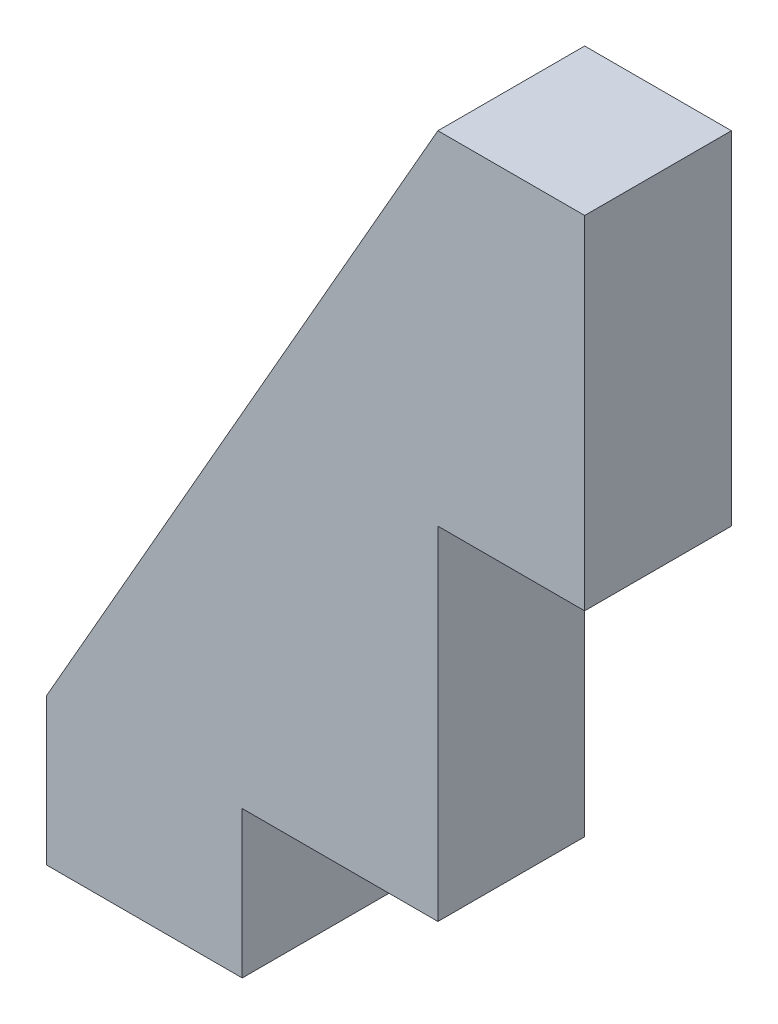
ISO-10303-21;
HEADER;
FILE_DESCRIPTION(('STEP AP214'),'2;1');
FILE_NAME('part.step','',(''),(''),'','','');
FILE_SCHEMA(('AUTOMOTIVE_DESIGN { 1 0 10303 214 1 1 1 1 }'));
ENDSEC;
DATA;
#1=APPLICATION_CONTEXT('core data for automotive mechanical design processes');
#2=APPLICATION_PROTOCOL_DEFINITION('international standard','automotive_design',2000,#1);
#3=PRODUCT_CONTEXT('',#1,'mechanical');
#4=PRODUCT('Part','Part','',(#3));
#5=PRODUCT_RELATED_PRODUCT_CATEGORY('part','',(#4));
#6=PRODUCT_DEFINITION_FORMATION('','',#4);
#7=PRODUCT_DEFINITION_CONTEXT('part definition',#1,'design');
#8=PRODUCT_DEFINITION('design','',#6,#7);
#9=PRODUCT_DEFINITION_SHAPE('','',#8);
#10=(LENGTH_UNIT() NAMED_UNIT(*) SI_UNIT(.MILLI.,.METRE.));
#11=(NAMED_UNIT(*) PLANE_ANGLE_UNIT() SI_UNIT($,.RADIAN.));
#12=(NAMED_UNIT(*) SI_UNIT($,.STERADIAN.) SOLID_ANGLE_UNIT());
#13=UNCERTAINTY_MEASURE_WITH_UNIT(LENGTH_MEASURE(1.E-05),#10,'distance_accuracy_value','');
#14=(GEOMETRIC_REPRESENTATION_CONTEXT(3) GLOBAL_UNCERTAINTY_ASSIGNED_CONTEXT((#13)) GLOBAL_UNIT_ASSIGNED_CONTEXT((#10,
#11,#12)) REPRESENTATION_CONTEXT('',''));
#15=CARTESIAN_POINT('',(0.,0.,0.));
#16=DIRECTION('',(0.,0.,1.));
#17=DIRECTION('',(1.,0.,0.));
#18=AXIS2_PLACEMENT_3D('',#15,#16,#17);
#19=CARTESIAN_POINT('',(8.,0.,3.));
#20=DIRECTION('',(-1.,0.,0.));
#21=DIRECTION('',(0.,0.,1.));
#22=AXIS2_PLACEMENT_3D('',#19,#20,#21);
#23=PLANE('',#22);
#24=DIRECTION('',(0.,0.,-1.));
#25=VECTOR('',#24,1.);
#26=CARTESIAN_POINT('',(8.,7.,3.));
#27=LINE('',#26,#25);
#28=CARTESIAN_POINT('',(8.,7.,3.));
#29=VERTEX_POINT('',#28);
#30=CARTESIAN_POINT('',(8.,7.,0.));
#31=VERTEX_POINT('',#30);
#32=EDGE_CURVE('E54',#29,#31,#27,.T.);
#33=ORIENTED_EDGE('',*,*,#32,.F.);
#34=DIRECTION('',(0.,1.,0.));
#35=VECTOR('',#34,1.);
#36=CARTESIAN_POINT('',(8.,0.,3.));
#37=LINE('',#36,#35);
#38=CARTESIAN_POINT('',(8.,0.,3.));
#39=VERTEX_POINT('',#38);
#40=EDGE_CURVE('E167',#39,#29,#37,.T.);
#41=ORIENTED_EDGE('',*,*,#40,.F.);
#42=DIRECTION('',(0.,0.,-1.));
#43=VECTOR('',#42,1.);
#44=CARTESIAN_POINT('',(8.,0.,3.));
#45=LINE('',#44,#43);
#46=CARTESIAN_POINT('',(8.,0.,0.));
#47=VERTEX_POINT('',#46);
#48=EDGE_CURVE('E47',#39,#47,#45,.T.);
#49=ORIENTED_EDGE('',*,*,#48,.T.);
#50=DIRECTION('',(0.,1.,0.));
#51=VECTOR('',#50,1.);
#52=CARTESIAN_POINT('',(8.,0.,0.));
#53=LINE('',#52,#51);
#54=EDGE_CURVE('E165',#47,#31,#53,.T.);
#55=ORIENTED_EDGE('',*,*,#54,.T.);
#56=EDGE_LOOP('',(#33,#41,#49,#55));
#57=FACE_BOUND('',#56,.T.);
#58=ADVANCED_FACE('F39',(#57),#23,.F.);
#59=CARTESIAN_POINT('',(0.,0.,3.));
#60=DIRECTION('',(0.,1.,0.));
#61=DIRECTION('',(0.,0.,1.));
#62=AXIS2_PLACEMENT_3D('',#59,#60,#61);
#63=PLANE('',#62);
#64=DIRECTION('',(0.,0.,1.));
#65=VECTOR('',#64,1.);
#66=CARTESIAN_POINT('',(4.,0.,0.));
#67=LINE('',#66,#65);
#68=CARTESIAN_POINT('',(4.,0.,0.));
#69=VERTEX_POINT('',#68);
#70=CARTESIAN_POINT('',(4.,0.,3.));
#71=VERTEX_POINT('',#70);
#72=EDGE_CURVE('E62',#69,#71,#67,.T.);
#73=ORIENTED_EDGE('',*,*,#72,.F.);
#74=DIRECTION('',(1.,0.,0.));
#75=VECTOR('',#74,1.);
#76=CARTESIAN_POINT('',(0.,0.,0.));
#77=LINE('',#76,#75);
#78=EDGE_CURVE('E170',#69,#47,#77,.T.);
#79=ORIENTED_EDGE('',*,*,#78,.T.);
#80=ORIENTED_EDGE('',*,*,#48,.F.);
#81=DIRECTION('',(1.,0.,0.));
#82=VECTOR('',#81,1.);
#83=CARTESIAN_POINT('',(0.,0.,3.));
#84=LINE('',#83,#82);
#85=EDGE_CURVE('E164',#71,#39,#84,.T.);
#86=ORIENTED_EDGE('',*,*,#85,.F.);
#87=EDGE_LOOP('',(#73,#79,#80,#86));
#88=FACE_BOUND('',#87,.T.);
#89=ADVANCED_FACE('F199',(#88),#63,.F.);
#90=CARTESIAN_POINT('',(8.,14.,3.));
#91=DIRECTION('',(0.868243142124459,-0.496138938356834,0.));
#92=DIRECTION('',(0.496138938356834,0.868243142124459,0.));
#93=AXIS2_PLACEMENT_3D('',#90,#91,#92);
#94=PLANE('',#93);
#95=DIRECTION('',(-0.496138938356834,-0.868243142124459,0.));
#96=VECTOR('',#95,1.);
#97=CARTESIAN_POINT('',(8.,14.,0.));
#98=LINE('',#97,#96);
#99=CARTESIAN_POINT('',(8.,14.,0.));
#100=VERTEX_POINT('',#99);
#101=CARTESIAN_POINT('',(0.,0.,0.));
#102=VERTEX_POINT('',#101);
#103=EDGE_CURVE('E161',#100,#102,#98,.T.);
#104=ORIENTED_EDGE('',*,*,#103,.T.);
#105=DIRECTION('',(0.,0.,-1.));
#106=VECTOR('',#105,1.);
#107=CARTESIAN_POINT('',(0.,0.,3.));
#108=LINE('',#107,#106);
#109=CARTESIAN_POINT('',(0.,0.,3.));
#110=VERTEX_POINT('',#109);
#111=EDGE_CURVE('E11',#110,#102,#108,.T.);
#112=ORIENTED_EDGE('',*,*,#111,.F.);
#113=DIRECTION('',(-0.496138938356834,-0.868243142124459,0.));
#114=VECTOR('',#113,1.);
#115=CARTESIAN_POINT('',(8.,14.,3.));
#116=LINE('',#115,#114);
#117=CARTESIAN_POINT('',(8.,14.,3.));
#118=VERTEX_POINT('',#117);
#119=EDGE_CURVE('E162',#118,#110,#116,.T.);
#120=ORIENTED_EDGE('',*,*,#119,.F.);
#121=DIRECTION('',(0.,0.,-1.));
#122=VECTOR('',#121,1.);
#123=CARTESIAN_POINT('',(8.,14.,3.));
#124=LINE('',#123,#122);
#125=EDGE_CURVE('E133',#118,#100,#124,.T.);
#126=ORIENTED_EDGE('',*,*,#125,.T.);
#127=EDGE_LOOP('',(#104,#112,#120,#126));
#128=FACE_BOUND('',#127,.T.);
#129=ADVANCED_FACE('F41',(#128),#94,.F.);
#130=CARTESIAN_POINT('',(0.,0.,3.));
#131=DIRECTION('',(0.,0.,1.));
#132=DIRECTION('',(1.,0.,0.));
#133=AXIS2_PLACEMENT_3D('',#130,#131,#132);
#134=PLANE('',#133);
#135=ORIENTED_EDGE('',*,*,#119,.T.);
#136=DIRECTION('',(0.,1.,0.));
#137=VECTOR('',#136,1.);
#138=CARTESIAN_POINT('',(0.,-3.,3.));
#139=LINE('',#138,#137);
#140=CARTESIAN_POINT('',(0.,-3.,3.));
#141=VERTEX_POINT('',#140);
#142=EDGE_CURVE('E148',#141,#110,#139,.T.);
#143=ORIENTED_EDGE('',*,*,#142,.F.);
#144=DIRECTION('',(-1.,0.,0.));
#145=VECTOR('',#144,1.);
#146=CARTESIAN_POINT('',(4.,-3.,3.));
#147=LINE('',#146,#145);
#148=CARTESIAN_POINT('',(4.,-3.,3.));
#149=VERTEX_POINT('',#148);
#150=EDGE_CURVE('E147',#149,#141,#147,.T.);
#151=ORIENTED_EDGE('',*,*,#150,.F.);
#152=DIRECTION('',(0.,1.,0.));
#153=VECTOR('',#152,1.);
#154=CARTESIAN_POINT('',(4.,-3.,3.));
#155=LINE('',#154,#153);
#156=EDGE_CURVE('E152',#149,#71,#155,.T.);
#157=ORIENTED_EDGE('',*,*,#156,.T.);
#158=ORIENTED_EDGE('',*,*,#85,.T.);
#159=ORIENTED_EDGE('',*,*,#40,.T.);
#160=DIRECTION('',(-1.,0.,0.));
#161=VECTOR('',#160,1.);
#162=CARTESIAN_POINT('',(11.,7.,3.));
#163=LINE('',#162,#161);
#164=CARTESIAN_POINT('',(11.,7.,3.));
#165=VERTEX_POINT('',#164);
#166=EDGE_CURVE('E118',#165,#29,#163,.T.);
#167=ORIENTED_EDGE('',*,*,#166,.F.);
#168=DIRECTION('',(0.,-1.,0.));
#169=VECTOR('',#168,1.);
#170=CARTESIAN_POINT('',(11.,14.,3.));
#171=LINE('',#170,#169);
#172=CARTESIAN_POINT('',(11.,14.,3.));
#173=VERTEX_POINT('',#172);
#174=EDGE_CURVE('E111',#173,#165,#171,.T.);
#175=ORIENTED_EDGE('',*,*,#174,.F.);
#176=DIRECTION('',(-1.,0.,0.));
#177=VECTOR('',#176,1.);
#178=CARTESIAN_POINT('',(11.,14.,3.));
#179=LINE('',#178,#177);
#180=EDGE_CURVE('E115',#173,#118,#179,.T.);
#181=ORIENTED_EDGE('',*,*,#180,.T.);
#182=EDGE_LOOP('',(#135,#143,#151,#157,#158,#159,#167,#175,#181));
#183=FACE_BOUND('',#182,.T.);
#184=ADVANCED_FACE('F113',(#183),#134,.T.);
#185=CARTESIAN_POINT('',(0.,0.,0.));
#186=DIRECTION('',(0.,0.,1.));
#187=DIRECTION('',(1.,0.,0.));
#188=AXIS2_PLACEMENT_3D('',#185,#186,#187);
#189=PLANE('',#188);
#190=ORIENTED_EDGE('',*,*,#103,.F.);
#191=DIRECTION('',(-1.,0.,0.));
#192=VECTOR('',#191,1.);
#193=CARTESIAN_POINT('',(11.,14.,0.));
#194=LINE('',#193,#192);
#195=CARTESIAN_POINT('',(11.,14.,0.));
#196=VERTEX_POINT('',#195);
#197=EDGE_CURVE('E183',#196,#100,#194,.T.);
#198=ORIENTED_EDGE('',*,*,#197,.F.);
#199=DIRECTION('',(0.,1.,0.));
#200=VECTOR('',#199,1.);
#201=CARTESIAN_POINT('',(11.,7.,0.));
#202=LINE('',#201,#200);
#203=CARTESIAN_POINT('',(11.,7.,0.));
#204=VERTEX_POINT('',#203);
#205=EDGE_CURVE('E127',#204,#196,#202,.T.);
#206=ORIENTED_EDGE('',*,*,#205,.F.);
#207=DIRECTION('',(-1.,0.,0.));
#208=VECTOR('',#207,1.);
#209=CARTESIAN_POINT('',(11.,7.,0.));
#210=LINE('',#209,#208);
#211=EDGE_CURVE('E137',#204,#31,#210,.T.);
#212=ORIENTED_EDGE('',*,*,#211,.T.);
#213=ORIENTED_EDGE('',*,*,#54,.F.);
#214=ORIENTED_EDGE('',*,*,#78,.F.);
#215=DIRECTION('',(0.,1.,0.));
#216=VECTOR('',#215,1.);
#217=CARTESIAN_POINT('',(4.,-3.,0.));
#218=LINE('',#217,#216);
#219=CARTESIAN_POINT('',(4.,-3.,0.));
#220=VERTEX_POINT('',#219);
#221=EDGE_CURVE('E155',#220,#69,#218,.T.);
#222=ORIENTED_EDGE('',*,*,#221,.F.);
#223=DIRECTION('',(1.,0.,0.));
#224=VECTOR('',#223,1.);
#225=CARTESIAN_POINT('',(0.,-3.,0.));
#226=LINE('',#225,#224);
#227=CARTESIAN_POINT('',(0.,-3.,0.));
#228=VERTEX_POINT('',#227);
#229=EDGE_CURVE('E143',#228,#220,#226,.T.);
#230=ORIENTED_EDGE('',*,*,#229,.F.);
#231=DIRECTION('',(0.,1.,0.));
#232=VECTOR('',#231,1.);
#233=CARTESIAN_POINT('',(0.,-3.,0.));
#234=LINE('',#233,#232);
#235=EDGE_CURVE('E158',#228,#102,#234,.T.);
#236=ORIENTED_EDGE('',*,*,#235,.T.);
#237=EDGE_LOOP('',(#190,#198,#206,#212,#213,#214,#222,#230,#236));
#238=FACE_BOUND('',#237,.T.);
#239=ADVANCED_FACE('F179',(#238),#189,.F.);
#240=CARTESIAN_POINT('',(0.,-3.,3.));
#241=DIRECTION('',(1.,0.,0.));
#242=DIRECTION('',(0.,0.,-1.));
#243=AXIS2_PLACEMENT_3D('',#240,#241,#242);
#244=PLANE('',#243);
#245=ORIENTED_EDGE('',*,*,#111,.T.);
#246=ORIENTED_EDGE('',*,*,#235,.F.);
#247=DIRECTION('',(0.,0.,-1.));
#248=VECTOR('',#247,1.);
#249=CARTESIAN_POINT('',(0.,-3.,3.));
#250=LINE('',#249,#248);
#251=EDGE_CURVE('E135',#141,#228,#250,.T.);
#252=ORIENTED_EDGE('',*,*,#251,.F.);
#253=ORIENTED_EDGE('',*,*,#142,.T.);
#254=EDGE_LOOP('',(#245,#246,#252,#253));
#255=FACE_BOUND('',#254,.T.);
#256=ADVANCED_FACE('F207',(#255),#244,.F.);
#257=CARTESIAN_POINT('',(4.,-3.,0.));
#258=DIRECTION('',(-1.,0.,0.));
#259=DIRECTION('',(0.,0.,1.));
#260=AXIS2_PLACEMENT_3D('',#257,#258,#259);
#261=PLANE('',#260);
#262=ORIENTED_EDGE('',*,*,#72,.T.);
#263=ORIENTED_EDGE('',*,*,#156,.F.);
#264=DIRECTION('',(0.,0.,1.));
#265=VECTOR('',#264,1.);
#266=CARTESIAN_POINT('',(4.,-3.,0.));
#267=LINE('',#266,#265);
#268=EDGE_CURVE('E145',#220,#149,#267,.T.);
#269=ORIENTED_EDGE('',*,*,#268,.F.);
#270=ORIENTED_EDGE('',*,*,#221,.T.);
#271=EDGE_LOOP('',(#262,#263,#269,#270));
#272=FACE_BOUND('',#271,.T.);
#273=ADVANCED_FACE('F212',(#272),#261,.F.);
#274=CARTESIAN_POINT('',(0.,-3.,0.));
#275=DIRECTION('',(0.,-1.,0.));
#276=DIRECTION('',(0.,0.,-1.));
#277=AXIS2_PLACEMENT_3D('',#274,#275,#276);
#278=PLANE('',#277);
#279=ORIENTED_EDGE('',*,*,#251,.T.);
#280=ORIENTED_EDGE('',*,*,#229,.T.);
#281=ORIENTED_EDGE('',*,*,#268,.T.);
#282=ORIENTED_EDGE('',*,*,#150,.T.);
#283=EDGE_LOOP('',(#279,#280,#281,#282));
#284=FACE_BOUND('',#283,.T.);
#285=ADVANCED_FACE('F196',(#284),#278,.T.);
#286=CARTESIAN_POINT('',(11.,14.,0.));
#287=DIRECTION('',(0.,-1.,0.));
#288=DIRECTION('',(0.,0.,-1.));
#289=AXIS2_PLACEMENT_3D('',#286,#287,#288);
#290=PLANE('',#289);
#291=ORIENTED_EDGE('',*,*,#125,.F.);
#292=ORIENTED_EDGE('',*,*,#180,.F.);
#293=DIRECTION('',(0.,0.,1.));
#294=VECTOR('',#293,1.);
#295=CARTESIAN_POINT('',(11.,14.,0.));
#296=LINE('',#295,#294);
#297=EDGE_CURVE('E122',#196,#173,#296,.T.);
#298=ORIENTED_EDGE('',*,*,#297,.F.);
#299=ORIENTED_EDGE('',*,*,#197,.T.);
#300=EDGE_LOOP('',(#291,#292,#298,#299));
#301=FACE_BOUND('',#300,.T.);
#302=ADVANCED_FACE('F132',(#301),#290,.F.);
#303=CARTESIAN_POINT('',(11.,7.,3.));
#304=DIRECTION('',(0.,1.,0.));
#305=DIRECTION('',(0.,0.,1.));
#306=AXIS2_PLACEMENT_3D('',#303,#304,#305);
#307=PLANE('',#306);
#308=ORIENTED_EDGE('',*,*,#32,.T.);
#309=ORIENTED_EDGE('',*,*,#211,.F.);
#310=DIRECTION('',(0.,0.,-1.));
#311=VECTOR('',#310,1.);
#312=CARTESIAN_POINT('',(11.,7.,3.));
#313=LINE('',#312,#311);
#314=EDGE_CURVE('E121',#165,#204,#313,.T.);
#315=ORIENTED_EDGE('',*,*,#314,.F.);
#316=ORIENTED_EDGE('',*,*,#166,.T.);
#317=EDGE_LOOP('',(#308,#309,#315,#316));
#318=FACE_BOUND('',#317,.T.);
#319=ADVANCED_FACE('F188',(#318),#307,.F.);
#320=CARTESIAN_POINT('',(11.,0.,0.));
#321=DIRECTION('',(1.,0.,0.));
#322=DIRECTION('',(0.,0.,-1.));
#323=AXIS2_PLACEMENT_3D('',#320,#321,#322);
#324=PLANE('',#323);
#325=ORIENTED_EDGE('',*,*,#297,.T.);
#326=ORIENTED_EDGE('',*,*,#174,.T.);
#327=ORIENTED_EDGE('',*,*,#314,.T.);
#328=ORIENTED_EDGE('',*,*,#205,.T.);
#329=EDGE_LOOP('',(#325,#326,#327,#328));
#330=FACE_BOUND('',#329,.T.);
#331=ADVANCED_FACE('F125',(#330),#324,.T.);
#332=CLOSED_SHELL('',(#58,#89,#129,#184,#239,#256,#273,#285,#302,#319,#331));
#333=MANIFOLD_SOLID_BREP('B2',#332);
#334=ADVANCED_BREP_SHAPE_REPRESENTATION('',(#18,#333),#14);
#335=SHAPE_DEFINITION_REPRESENTATION(#9,#334);
ENDSEC;
END-ISO-10303-21;
